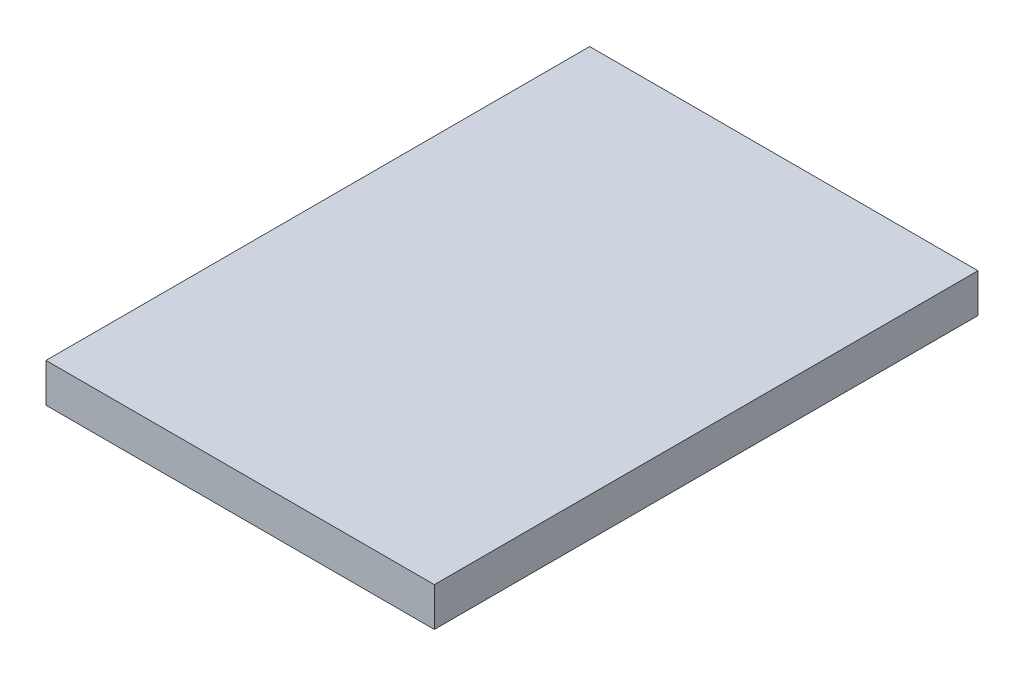
ISO-10303-21;
HEADER;
FILE_DESCRIPTION(('STEP AP214'),'2;1');
FILE_NAME('part.step','',(''),(''),'','','');
FILE_SCHEMA(('AUTOMOTIVE_DESIGN { 1 0 10303 214 1 1 1 1 }'));
ENDSEC;
DATA;
#1=APPLICATION_CONTEXT('core data for automotive mechanical design processes');
#2=APPLICATION_PROTOCOL_DEFINITION('international standard','automotive_design',2000,#1);
#3=PRODUCT_CONTEXT('',#1,'mechanical');
#4=PRODUCT('Part','Part','',(#3));
#5=PRODUCT_RELATED_PRODUCT_CATEGORY('part','',(#4));
#6=PRODUCT_DEFINITION_FORMATION('','',#4);
#7=PRODUCT_DEFINITION_CONTEXT('part definition',#1,'design');
#8=PRODUCT_DEFINITION('design','',#6,#7);
#9=PRODUCT_DEFINITION_SHAPE('','',#8);
#10=(LENGTH_UNIT() NAMED_UNIT(*) SI_UNIT(.MILLI.,.METRE.));
#11=(NAMED_UNIT(*) PLANE_ANGLE_UNIT() SI_UNIT($,.RADIAN.));
#12=(NAMED_UNIT(*) SI_UNIT($,.STERADIAN.) SOLID_ANGLE_UNIT());
#13=UNCERTAINTY_MEASURE_WITH_UNIT(LENGTH_MEASURE(1.E-05),#10,'distance_accuracy_value','');
#14=(GEOMETRIC_REPRESENTATION_CONTEXT(3) GLOBAL_UNCERTAINTY_ASSIGNED_CONTEXT((#13)) GLOBAL_UNIT_ASSIGNED_CONTEXT((#10,
#11,#12)) REPRESENTATION_CONTEXT('',''));
#15=CARTESIAN_POINT('',(0.,0.,0.));
#16=DIRECTION('',(0.,0.,1.));
#17=DIRECTION('',(1.,0.,0.));
#18=AXIS2_PLACEMENT_3D('',#15,#16,#17);
#19=CARTESIAN_POINT('',(0.,3.175,0.));
#20=DIRECTION('',(-1.,0.,0.));
#21=DIRECTION('',(0.,0.,1.));
#22=AXIS2_PLACEMENT_3D('',#19,#20,#21);
#23=PLANE('',#22);
#24=DIRECTION('',(0.,0.,-1.));
#25=VECTOR('',#24,1.);
#26=CARTESIAN_POINT('',(0.,0.,0.));
#27=LINE('',#26,#25);
#28=CARTESIAN_POINT('',(0.,0.,0.));
#29=VERTEX_POINT('',#28);
#30=CARTESIAN_POINT('',(0.,0.,-44.45));
#31=VERTEX_POINT('',#30);
#32=EDGE_CURVE('E96',#29,#31,#27,.T.);
#33=ORIENTED_EDGE('',*,*,#32,.T.);
#34=DIRECTION('',(0.,-1.,0.));
#35=VECTOR('',#34,1.);
#36=CARTESIAN_POINT('',(0.,3.175,-44.45));
#37=LINE('',#36,#35);
#38=CARTESIAN_POINT('',(0.,3.175,-44.45));
#39=VERTEX_POINT('',#38);
#40=EDGE_CURVE('E11',#39,#31,#37,.T.);
#41=ORIENTED_EDGE('',*,*,#40,.F.);
#42=DIRECTION('',(0.,0.,-1.));
#43=VECTOR('',#42,1.);
#44=CARTESIAN_POINT('',(0.,3.175,0.));
#45=LINE('',#44,#43);
#46=CARTESIAN_POINT('',(0.,3.175,0.));
#47=VERTEX_POINT('',#46);
#48=EDGE_CURVE('E84',#47,#39,#45,.T.);
#49=ORIENTED_EDGE('',*,*,#48,.F.);
#50=DIRECTION('',(0.,-1.,0.));
#51=VECTOR('',#50,1.);
#52=CARTESIAN_POINT('',(0.,3.175,0.));
#53=LINE('',#52,#51);
#54=EDGE_CURVE('E92',#47,#29,#53,.T.);
#55=ORIENTED_EDGE('',*,*,#54,.T.);
#56=EDGE_LOOP('',(#33,#41,#49,#55));
#57=FACE_BOUND('',#56,.T.);
#58=ADVANCED_FACE('F33',(#57),#23,.F.);
#59=CARTESIAN_POINT('',(0.,3.175,-44.45));
#60=DIRECTION('',(0.,0.,1.));
#61=DIRECTION('',(1.,0.,0.));
#62=AXIS2_PLACEMENT_3D('',#59,#60,#61);
#63=PLANE('',#62);
#64=DIRECTION('',(-1.,0.,0.));
#65=VECTOR('',#64,1.);
#66=CARTESIAN_POINT('',(0.,0.,-44.45));
#67=LINE('',#66,#65);
#68=CARTESIAN_POINT('',(-31.75,0.,-44.45));
#69=VERTEX_POINT('',#68);
#70=EDGE_CURVE('E88',#31,#69,#67,.T.);
#71=ORIENTED_EDGE('',*,*,#70,.T.);
#72=DIRECTION('',(0.,-1.,0.));
#73=VECTOR('',#72,1.);
#74=CARTESIAN_POINT('',(-31.75,3.175,-44.45));
#75=LINE('',#74,#73);
#76=CARTESIAN_POINT('',(-31.75,3.175,-44.45));
#77=VERTEX_POINT('',#76);
#78=EDGE_CURVE('E41',#77,#69,#75,.T.);
#79=ORIENTED_EDGE('',*,*,#78,.F.);
#80=DIRECTION('',(-1.,0.,0.));
#81=VECTOR('',#80,1.);
#82=CARTESIAN_POINT('',(0.,3.175,-44.45));
#83=LINE('',#82,#81);
#84=EDGE_CURVE('E79',#39,#77,#83,.T.);
#85=ORIENTED_EDGE('',*,*,#84,.F.);
#86=ORIENTED_EDGE('',*,*,#40,.T.);
#87=EDGE_LOOP('',(#71,#79,#85,#86));
#88=FACE_BOUND('',#87,.T.);
#89=ADVANCED_FACE('F87',(#88),#63,.F.);
#90=CARTESIAN_POINT('',(-31.75,3.175,0.));
#91=DIRECTION('',(1.,0.,0.));
#92=DIRECTION('',(0.,0.,-1.));
#93=AXIS2_PLACEMENT_3D('',#90,#91,#92);
#94=PLANE('',#93);
#95=DIRECTION('',(0.,0.,1.));
#96=VECTOR('',#95,1.);
#97=CARTESIAN_POINT('',(-31.75,0.,0.));
#98=LINE('',#97,#96);
#99=CARTESIAN_POINT('',(-31.75,0.,0.));
#100=VERTEX_POINT('',#99);
#101=EDGE_CURVE('E66',#69,#100,#98,.T.);
#102=ORIENTED_EDGE('',*,*,#101,.T.);
#103=DIRECTION('',(0.,-1.,0.));
#104=VECTOR('',#103,1.);
#105=CARTESIAN_POINT('',(-31.75,3.175,0.));
#106=LINE('',#105,#104);
#107=CARTESIAN_POINT('',(-31.75,3.175,0.));
#108=VERTEX_POINT('',#107);
#109=EDGE_CURVE('E89',#108,#100,#106,.T.);
#110=ORIENTED_EDGE('',*,*,#109,.F.);
#111=DIRECTION('',(0.,0.,1.));
#112=VECTOR('',#111,1.);
#113=CARTESIAN_POINT('',(-31.75,3.175,0.));
#114=LINE('',#113,#112);
#115=EDGE_CURVE('E82',#77,#108,#114,.T.);
#116=ORIENTED_EDGE('',*,*,#115,.F.);
#117=ORIENTED_EDGE('',*,*,#78,.T.);
#118=EDGE_LOOP('',(#102,#110,#116,#117));
#119=FACE_BOUND('',#118,.T.);
#120=ADVANCED_FACE('F90',(#119),#94,.F.);
#121=CARTESIAN_POINT('',(0.,3.175,0.));
#122=DIRECTION('',(0.,0.,-1.));
#123=DIRECTION('',(-1.,0.,0.));
#124=AXIS2_PLACEMENT_3D('',#121,#122,#123);
#125=PLANE('',#124);
#126=DIRECTION('',(1.,0.,0.));
#127=VECTOR('',#126,1.);
#128=CARTESIAN_POINT('',(0.,0.,0.));
#129=LINE('',#128,#127);
#130=EDGE_CURVE('E72',#100,#29,#129,.T.);
#131=ORIENTED_EDGE('',*,*,#130,.T.);
#132=ORIENTED_EDGE('',*,*,#54,.F.);
#133=DIRECTION('',(1.,0.,0.));
#134=VECTOR('',#133,1.);
#135=CARTESIAN_POINT('',(0.,3.175,0.));
#136=LINE('',#135,#134);
#137=EDGE_CURVE('E49',#108,#47,#136,.T.);
#138=ORIENTED_EDGE('',*,*,#137,.F.);
#139=ORIENTED_EDGE('',*,*,#109,.T.);
#140=EDGE_LOOP('',(#131,#132,#138,#139));
#141=FACE_BOUND('',#140,.T.);
#142=ADVANCED_FACE('F103',(#141),#125,.F.);
#143=CARTESIAN_POINT('',(0.,3.175,0.));
#144=DIRECTION('',(0.,1.,0.));
#145=DIRECTION('',(0.,0.,1.));
#146=AXIS2_PLACEMENT_3D('',#143,#144,#145);
#147=PLANE('',#146);
#148=ORIENTED_EDGE('',*,*,#48,.T.);
#149=ORIENTED_EDGE('',*,*,#84,.T.);
#150=ORIENTED_EDGE('',*,*,#115,.T.);
#151=ORIENTED_EDGE('',*,*,#137,.T.);
#152=EDGE_LOOP('',(#148,#149,#150,#151));
#153=FACE_BOUND('',#152,.T.);
#154=ADVANCED_FACE('F80',(#153),#147,.T.);
#155=CARTESIAN_POINT('',(0.,0.,0.));
#156=DIRECTION('',(0.,1.,0.));
#157=DIRECTION('',(0.,0.,1.));
#158=AXIS2_PLACEMENT_3D('',#155,#156,#157);
#159=PLANE('',#158);
#160=ORIENTED_EDGE('',*,*,#32,.F.);
#161=ORIENTED_EDGE('',*,*,#130,.F.);
#162=ORIENTED_EDGE('',*,*,#101,.F.);
#163=ORIENTED_EDGE('',*,*,#70,.F.);
#164=EDGE_LOOP('',(#160,#161,#162,#163));
#165=FACE_BOUND('',#164,.T.);
#166=ADVANCED_FACE('F106',(#165),#159,.F.);
#167=CLOSED_SHELL('',(#58,#89,#120,#142,#154,#166));
#168=MANIFOLD_SOLID_BREP('B2',#167);
#169=ADVANCED_BREP_SHAPE_REPRESENTATION('',(#18,#168),#14);
#170=SHAPE_DEFINITION_REPRESENTATION(#9,#169);
ENDSEC;
END-ISO-10303-21;
